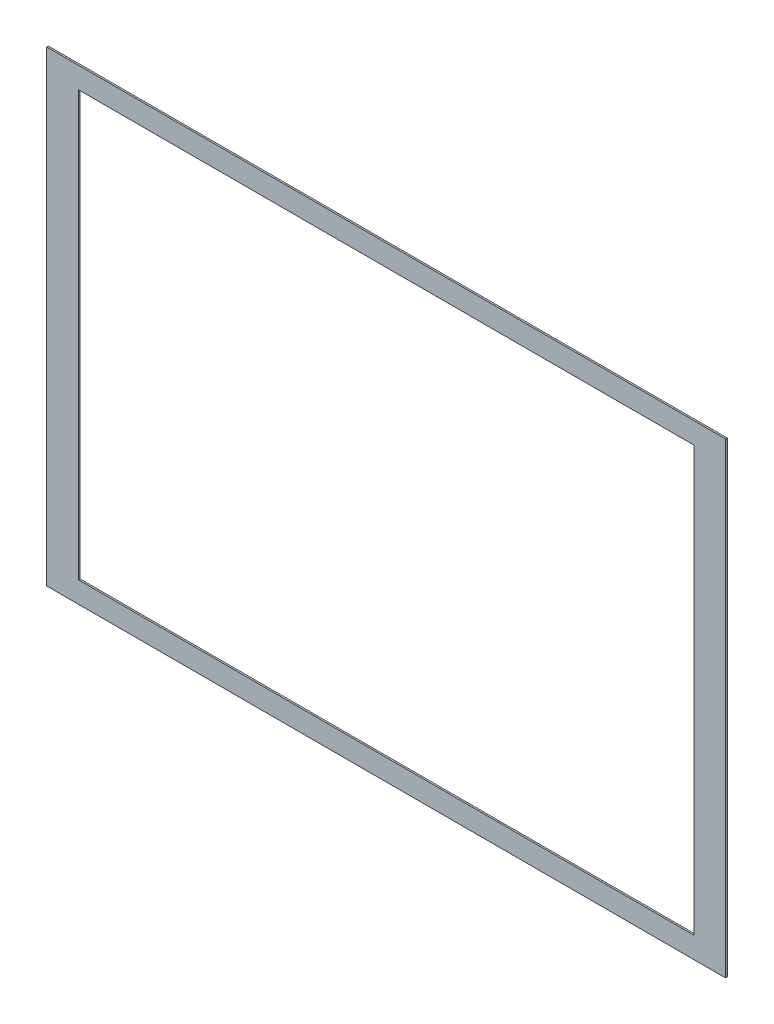
ISO-10303-21;
HEADER;
FILE_DESCRIPTION(('STEP AP214'),'2;1');
FILE_NAME('part.step','',(''),(''),'','','');
FILE_SCHEMA(('AUTOMOTIVE_DESIGN { 1 0 10303 214 1 1 1 1 }'));
ENDSEC;
DATA;
#1=APPLICATION_CONTEXT('core data for automotive mechanical design processes');
#2=APPLICATION_PROTOCOL_DEFINITION('international standard','automotive_design',2000,#1);
#3=PRODUCT_CONTEXT('',#1,'mechanical');
#4=PRODUCT('Part','Part','',(#3));
#5=PRODUCT_RELATED_PRODUCT_CATEGORY('part','',(#4));
#6=PRODUCT_DEFINITION_FORMATION('','',#4);
#7=PRODUCT_DEFINITION_CONTEXT('part definition',#1,'design');
#8=PRODUCT_DEFINITION('design','',#6,#7);
#9=PRODUCT_DEFINITION_SHAPE('','',#8);
#10=(LENGTH_UNIT() NAMED_UNIT(*) SI_UNIT(.MILLI.,.METRE.));
#11=(NAMED_UNIT(*) PLANE_ANGLE_UNIT() SI_UNIT($,.RADIAN.));
#12=(NAMED_UNIT(*) SI_UNIT($,.STERADIAN.) SOLID_ANGLE_UNIT());
#13=UNCERTAINTY_MEASURE_WITH_UNIT(LENGTH_MEASURE(1.E-05),#10,'distance_accuracy_value','');
#14=(GEOMETRIC_REPRESENTATION_CONTEXT(3) GLOBAL_UNCERTAINTY_ASSIGNED_CONTEXT((#13)) GLOBAL_UNIT_ASSIGNED_CONTEXT((#10,
#11,#12)) REPRESENTATION_CONTEXT('',''));
#15=CARTESIAN_POINT('',(0.,0.,0.));
#16=DIRECTION('',(0.,0.,1.));
#17=DIRECTION('',(1.,0.,0.));
#18=AXIS2_PLACEMENT_3D('',#15,#16,#17);
#19=CARTESIAN_POINT('',(0.,0.,40.));
#20=DIRECTION('',(0.,0.,-1.));
#21=DIRECTION('',(-1.,0.,0.));
#22=AXIS2_PLACEMENT_3D('',#19,#20,#21);
#23=PLANE('',#22);
#24=DIRECTION('',(0.,-1.,0.));
#25=VECTOR('',#24,1.);
#26=CARTESIAN_POINT('',(30.,600.,40.));
#27=LINE('',#26,#25);
#28=CARTESIAN_POINT('',(30.,1040.,40.));
#29=VERTEX_POINT('',#28);
#30=CARTESIAN_POINT('',(30.,600.,40.));
#31=VERTEX_POINT('',#30);
#32=EDGE_CURVE('E126',#29,#31,#27,.T.);
#33=ORIENTED_EDGE('',*,*,#32,.T.);
#34=DIRECTION('',(1.,0.,0.));
#35=VECTOR('',#34,1.);
#36=CARTESIAN_POINT('',(30.,600.,40.));
#37=LINE('',#36,#35);
#38=CARTESIAN_POINT('',(670.,600.,40.));
#39=VERTEX_POINT('',#38);
#40=EDGE_CURVE('E129',#31,#39,#37,.T.);
#41=ORIENTED_EDGE('',*,*,#40,.T.);
#42=DIRECTION('',(0.,1.,0.));
#43=VECTOR('',#42,1.);
#44=CARTESIAN_POINT('',(670.,600.,40.));
#45=LINE('',#44,#43);
#46=CARTESIAN_POINT('',(670.,1040.,40.));
#47=VERTEX_POINT('',#46);
#48=EDGE_CURVE('E132',#39,#47,#45,.T.);
#49=ORIENTED_EDGE('',*,*,#48,.T.);
#50=DIRECTION('',(-1.,0.,0.));
#51=VECTOR('',#50,1.);
#52=CARTESIAN_POINT('',(30.,1040.,40.));
#53=LINE('',#52,#51);
#54=EDGE_CURVE('E134',#47,#29,#53,.T.);
#55=ORIENTED_EDGE('',*,*,#54,.T.);
#56=EDGE_LOOP('',(#33,#41,#49,#55));
#57=FACE_BOUND('',#56,.T.);
#58=DIRECTION('',(0.,-1.,0.));
#59=VECTOR('',#58,1.);
#60=CARTESIAN_POINT('',(60.,0.,40.));
#61=LINE('',#60,#59);
#62=CARTESIAN_POINT('',(60.,1020.,40.));
#63=VERTEX_POINT('',#62);
#64=CARTESIAN_POINT('',(60.,620.,40.));
#65=VERTEX_POINT('',#64);
#66=EDGE_CURVE('E112',#63,#65,#61,.T.);
#67=ORIENTED_EDGE('',*,*,#66,.F.);
#68=DIRECTION('',(-1.,0.,0.));
#69=VECTOR('',#68,1.);
#70=CARTESIAN_POINT('',(0.,1020.,40.));
#71=LINE('',#70,#69);
#72=CARTESIAN_POINT('',(640.,1020.,40.));
#73=VERTEX_POINT('',#72);
#74=EDGE_CURVE('E101',#73,#63,#71,.T.);
#75=ORIENTED_EDGE('',*,*,#74,.F.);
#76=DIRECTION('',(0.,1.,0.));
#77=VECTOR('',#76,1.);
#78=CARTESIAN_POINT('',(640.,0.,40.));
#79=LINE('',#78,#77);
#80=CARTESIAN_POINT('',(640.,620.,40.));
#81=VERTEX_POINT('',#80);
#82=EDGE_CURVE('E106',#81,#73,#79,.T.);
#83=ORIENTED_EDGE('',*,*,#82,.F.);
#84=DIRECTION('',(1.,0.,0.));
#85=VECTOR('',#84,1.);
#86=CARTESIAN_POINT('',(0.,620.,40.));
#87=LINE('',#86,#85);
#88=EDGE_CURVE('E117',#65,#81,#87,.T.);
#89=ORIENTED_EDGE('',*,*,#88,.F.);
#90=EDGE_LOOP('',(#67,#75,#83,#89));
#91=FACE_BOUND('',#90,.T.);
#92=ADVANCED_FACE('F39',(#57,#91),#23,.F.);
#93=CARTESIAN_POINT('',(0.,0.,38.5));
#94=DIRECTION('',(0.,0.,-1.));
#95=DIRECTION('',(-1.,0.,0.));
#96=AXIS2_PLACEMENT_3D('',#93,#94,#95);
#97=PLANE('',#96);
#98=DIRECTION('',(0.,-1.,0.));
#99=VECTOR('',#98,1.);
#100=CARTESIAN_POINT('',(30.,600.,38.5));
#101=LINE('',#100,#99);
#102=CARTESIAN_POINT('',(30.,1040.,38.5));
#103=VERTEX_POINT('',#102);
#104=CARTESIAN_POINT('',(30.,600.,38.5));
#105=VERTEX_POINT('',#104);
#106=EDGE_CURVE('E118',#103,#105,#101,.T.);
#107=ORIENTED_EDGE('',*,*,#106,.F.);
#108=DIRECTION('',(-1.,0.,0.));
#109=VECTOR('',#108,1.);
#110=CARTESIAN_POINT('',(30.,1040.,38.5));
#111=LINE('',#110,#109);
#112=CARTESIAN_POINT('',(670.,1040.,38.5));
#113=VERTEX_POINT('',#112);
#114=EDGE_CURVE('E130',#113,#103,#111,.T.);
#115=ORIENTED_EDGE('',*,*,#114,.F.);
#116=DIRECTION('',(0.,1.,0.));
#117=VECTOR('',#116,1.);
#118=CARTESIAN_POINT('',(670.,600.,38.5));
#119=LINE('',#118,#117);
#120=CARTESIAN_POINT('',(670.,600.,38.5));
#121=VERTEX_POINT('',#120);
#122=EDGE_CURVE('E138',#121,#113,#119,.T.);
#123=ORIENTED_EDGE('',*,*,#122,.F.);
#124=DIRECTION('',(1.,0.,0.));
#125=VECTOR('',#124,1.);
#126=CARTESIAN_POINT('',(30.,600.,38.5));
#127=LINE('',#126,#125);
#128=EDGE_CURVE('E121',#105,#121,#127,.T.);
#129=ORIENTED_EDGE('',*,*,#128,.F.);
#130=EDGE_LOOP('',(#107,#115,#123,#129));
#131=FACE_BOUND('',#130,.T.);
#132=DIRECTION('',(-1.,0.,0.));
#133=VECTOR('',#132,1.);
#134=CARTESIAN_POINT('',(0.,1020.,38.5));
#135=LINE('',#134,#133);
#136=CARTESIAN_POINT('',(640.,1020.,38.5));
#137=VERTEX_POINT('',#136);
#138=CARTESIAN_POINT('',(60.,1020.,38.5));
#139=VERTEX_POINT('',#138);
#140=EDGE_CURVE('E152',#137,#139,#135,.T.);
#141=ORIENTED_EDGE('',*,*,#140,.T.);
#142=DIRECTION('',(0.,-1.,0.));
#143=VECTOR('',#142,1.);
#144=CARTESIAN_POINT('',(60.,0.,38.5));
#145=LINE('',#144,#143);
#146=CARTESIAN_POINT('',(60.,620.,38.5));
#147=VERTEX_POINT('',#146);
#148=EDGE_CURVE('E11',#139,#147,#145,.T.);
#149=ORIENTED_EDGE('',*,*,#148,.T.);
#150=DIRECTION('',(1.,0.,0.));
#151=VECTOR('',#150,1.);
#152=CARTESIAN_POINT('',(0.,620.,38.5));
#153=LINE('',#152,#151);
#154=CARTESIAN_POINT('',(640.,620.,38.5));
#155=VERTEX_POINT('',#154);
#156=EDGE_CURVE('E47',#147,#155,#153,.T.);
#157=ORIENTED_EDGE('',*,*,#156,.T.);
#158=DIRECTION('',(0.,1.,0.));
#159=VECTOR('',#158,1.);
#160=CARTESIAN_POINT('',(640.,0.,38.5));
#161=LINE('',#160,#159);
#162=EDGE_CURVE('E154',#155,#137,#161,.T.);
#163=ORIENTED_EDGE('',*,*,#162,.T.);
#164=EDGE_LOOP('',(#141,#149,#157,#163));
#165=FACE_BOUND('',#164,.T.);
#166=ADVANCED_FACE('F158',(#131,#165),#97,.T.);
#167=CARTESIAN_POINT('',(30.,600.,40.));
#168=DIRECTION('',(1.,0.,0.));
#169=DIRECTION('',(0.,0.,-1.));
#170=AXIS2_PLACEMENT_3D('',#167,#168,#169);
#171=PLANE('',#170);
#172=ORIENTED_EDGE('',*,*,#106,.T.);
#173=DIRECTION('',(0.,0.,-1.));
#174=VECTOR('',#173,1.);
#175=CARTESIAN_POINT('',(30.,600.,40.));
#176=LINE('',#175,#174);
#177=EDGE_CURVE('E149',#31,#105,#176,.T.);
#178=ORIENTED_EDGE('',*,*,#177,.F.);
#179=ORIENTED_EDGE('',*,*,#32,.F.);
#180=DIRECTION('',(0.,0.,-1.));
#181=VECTOR('',#180,1.);
#182=CARTESIAN_POINT('',(30.,1040.,40.));
#183=LINE('',#182,#181);
#184=EDGE_CURVE('E135',#29,#103,#183,.T.);
#185=ORIENTED_EDGE('',*,*,#184,.T.);
#186=EDGE_LOOP('',(#172,#178,#179,#185));
#187=FACE_BOUND('',#186,.T.);
#188=ADVANCED_FACE('F41',(#187),#171,.F.);
#189=CARTESIAN_POINT('',(30.,600.,40.));
#190=DIRECTION('',(0.,1.,0.));
#191=DIRECTION('',(0.,0.,1.));
#192=AXIS2_PLACEMENT_3D('',#189,#190,#191);
#193=PLANE('',#192);
#194=ORIENTED_EDGE('',*,*,#128,.T.);
#195=DIRECTION('',(0.,0.,-1.));
#196=VECTOR('',#195,1.);
#197=CARTESIAN_POINT('',(670.,600.,40.));
#198=LINE('',#197,#196);
#199=EDGE_CURVE('E146',#39,#121,#198,.T.);
#200=ORIENTED_EDGE('',*,*,#199,.F.);
#201=ORIENTED_EDGE('',*,*,#40,.F.);
#202=ORIENTED_EDGE('',*,*,#177,.T.);
#203=EDGE_LOOP('',(#194,#200,#201,#202));
#204=FACE_BOUND('',#203,.T.);
#205=ADVANCED_FACE('F193',(#204),#193,.F.);
#206=CARTESIAN_POINT('',(670.,600.,40.));
#207=DIRECTION('',(-1.,0.,0.));
#208=DIRECTION('',(0.,0.,1.));
#209=AXIS2_PLACEMENT_3D('',#206,#207,#208);
#210=PLANE('',#209);
#211=ORIENTED_EDGE('',*,*,#122,.T.);
#212=DIRECTION('',(0.,0.,-1.));
#213=VECTOR('',#212,1.);
#214=CARTESIAN_POINT('',(670.,1040.,40.));
#215=LINE('',#214,#213);
#216=EDGE_CURVE('E143',#47,#113,#215,.T.);
#217=ORIENTED_EDGE('',*,*,#216,.F.);
#218=ORIENTED_EDGE('',*,*,#48,.F.);
#219=ORIENTED_EDGE('',*,*,#199,.T.);
#220=EDGE_LOOP('',(#211,#217,#218,#219));
#221=FACE_BOUND('',#220,.T.);
#222=ADVANCED_FACE('F190',(#221),#210,.F.);
#223=CARTESIAN_POINT('',(30.,1040.,40.));
#224=DIRECTION('',(0.,-1.,0.));
#225=DIRECTION('',(0.,0.,-1.));
#226=AXIS2_PLACEMENT_3D('',#223,#224,#225);
#227=PLANE('',#226);
#228=ORIENTED_EDGE('',*,*,#114,.T.);
#229=ORIENTED_EDGE('',*,*,#184,.F.);
#230=ORIENTED_EDGE('',*,*,#54,.F.);
#231=ORIENTED_EDGE('',*,*,#216,.T.);
#232=EDGE_LOOP('',(#228,#229,#230,#231));
#233=FACE_BOUND('',#232,.T.);
#234=ADVANCED_FACE('F188',(#233),#227,.F.);
#235=CARTESIAN_POINT('',(60.,620.,41.));
#236=DIRECTION('',(1.,0.,0.));
#237=DIRECTION('',(0.,0.,-1.));
#238=AXIS2_PLACEMENT_3D('',#235,#236,#237);
#239=PLANE('',#238);
#240=ORIENTED_EDGE('',*,*,#66,.T.);
#241=DIRECTION('',(0.,0.,-1.));
#242=VECTOR('',#241,1.);
#243=CARTESIAN_POINT('',(60.,620.,41.));
#244=LINE('',#243,#242);
#245=EDGE_CURVE('E107',#65,#147,#244,.T.);
#246=ORIENTED_EDGE('',*,*,#245,.T.);
#247=ORIENTED_EDGE('',*,*,#148,.F.);
#248=DIRECTION('',(0.,0.,-1.));
#249=VECTOR('',#248,1.);
#250=CARTESIAN_POINT('',(60.,1020.,41.));
#251=LINE('',#250,#249);
#252=EDGE_CURVE('E59',#63,#139,#251,.T.);
#253=ORIENTED_EDGE('',*,*,#252,.F.);
#254=EDGE_LOOP('',(#240,#246,#247,#253));
#255=FACE_BOUND('',#254,.T.);
#256=ADVANCED_FACE('F110',(#255),#239,.T.);
#257=CARTESIAN_POINT('',(60.,620.,41.));
#258=DIRECTION('',(0.,1.,0.));
#259=DIRECTION('',(0.,0.,1.));
#260=AXIS2_PLACEMENT_3D('',#257,#258,#259);
#261=PLANE('',#260);
#262=ORIENTED_EDGE('',*,*,#88,.T.);
#263=DIRECTION('',(0.,0.,-1.));
#264=VECTOR('',#263,1.);
#265=CARTESIAN_POINT('',(640.,620.,41.));
#266=LINE('',#265,#264);
#267=EDGE_CURVE('E163',#81,#155,#266,.T.);
#268=ORIENTED_EDGE('',*,*,#267,.T.);
#269=ORIENTED_EDGE('',*,*,#156,.F.);
#270=ORIENTED_EDGE('',*,*,#245,.F.);
#271=EDGE_LOOP('',(#262,#268,#269,#270));
#272=FACE_BOUND('',#271,.T.);
#273=ADVANCED_FACE('F161',(#272),#261,.T.);
#274=CARTESIAN_POINT('',(640.,620.,41.));
#275=DIRECTION('',(-1.,0.,0.));
#276=DIRECTION('',(0.,0.,1.));
#277=AXIS2_PLACEMENT_3D('',#274,#275,#276);
#278=PLANE('',#277);
#279=ORIENTED_EDGE('',*,*,#82,.T.);
#280=DIRECTION('',(0.,0.,-1.));
#281=VECTOR('',#280,1.);
#282=CARTESIAN_POINT('',(640.,1020.,41.));
#283=LINE('',#282,#281);
#284=EDGE_CURVE('E54',#73,#137,#283,.T.);
#285=ORIENTED_EDGE('',*,*,#284,.T.);
#286=ORIENTED_EDGE('',*,*,#162,.F.);
#287=ORIENTED_EDGE('',*,*,#267,.F.);
#288=EDGE_LOOP('',(#279,#285,#286,#287));
#289=FACE_BOUND('',#288,.T.);
#290=ADVANCED_FACE('F168',(#289),#278,.T.);
#291=CARTESIAN_POINT('',(60.,1020.,41.));
#292=DIRECTION('',(0.,-1.,0.));
#293=DIRECTION('',(0.,0.,-1.));
#294=AXIS2_PLACEMENT_3D('',#291,#292,#293);
#295=PLANE('',#294);
#296=ORIENTED_EDGE('',*,*,#74,.T.);
#297=ORIENTED_EDGE('',*,*,#252,.T.);
#298=ORIENTED_EDGE('',*,*,#140,.F.);
#299=ORIENTED_EDGE('',*,*,#284,.F.);
#300=EDGE_LOOP('',(#296,#297,#298,#299));
#301=FACE_BOUND('',#300,.T.);
#302=ADVANCED_FACE('F102',(#301),#295,.T.);
#303=CLOSED_SHELL('',(#92,#166,#188,#205,#222,#234,#256,#273,#290,#302));
#304=MANIFOLD_SOLID_BREP('B2',#303);
#305=ADVANCED_BREP_SHAPE_REPRESENTATION('',(#18,#304),#14);
#306=SHAPE_DEFINITION_REPRESENTATION(#9,#305);
ENDSEC;
END-ISO-10303-21;
